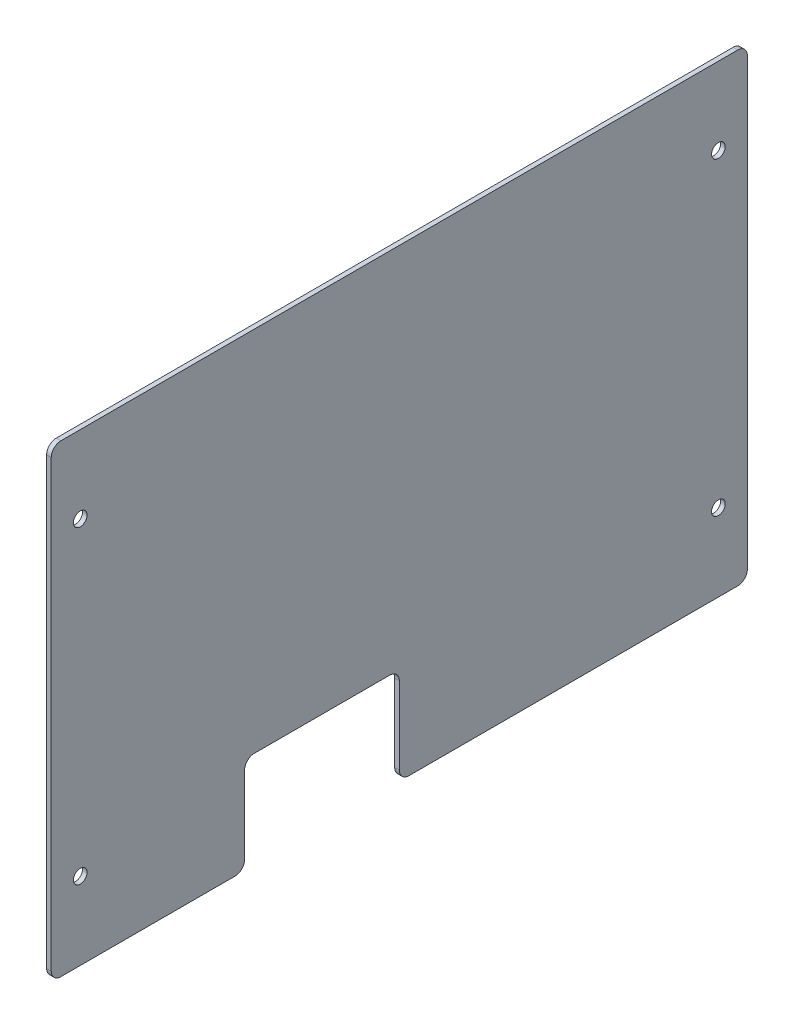
ISO-10303-21;
HEADER;
FILE_DESCRIPTION(('STEP AP214'),'2;1');
FILE_NAME('part.step','',(''),(''),'','','');
FILE_SCHEMA(('AUTOMOTIVE_DESIGN { 1 0 10303 214 1 1 1 1 }'));
ENDSEC;
DATA;
#1=APPLICATION_CONTEXT('core data for automotive mechanical design processes');
#2=APPLICATION_PROTOCOL_DEFINITION('international standard','automotive_design',2000,#1);
#3=PRODUCT_CONTEXT('',#1,'mechanical');
#4=PRODUCT('Part','Part','',(#3));
#5=PRODUCT_RELATED_PRODUCT_CATEGORY('part','',(#4));
#6=PRODUCT_DEFINITION_FORMATION('','',#4);
#7=PRODUCT_DEFINITION_CONTEXT('part definition',#1,'design');
#8=PRODUCT_DEFINITION('design','',#6,#7);
#9=PRODUCT_DEFINITION_SHAPE('','',#8);
#10=(LENGTH_UNIT() NAMED_UNIT(*) SI_UNIT(.MILLI.,.METRE.));
#11=(NAMED_UNIT(*) PLANE_ANGLE_UNIT() SI_UNIT($,.RADIAN.));
#12=(NAMED_UNIT(*) SI_UNIT($,.STERADIAN.) SOLID_ANGLE_UNIT());
#13=UNCERTAINTY_MEASURE_WITH_UNIT(LENGTH_MEASURE(1.E-05),#10,'distance_accuracy_value','');
#14=(GEOMETRIC_REPRESENTATION_CONTEXT(3) GLOBAL_UNCERTAINTY_ASSIGNED_CONTEXT((#13)) GLOBAL_UNIT_ASSIGNED_CONTEXT((#10,
#11,#12)) REPRESENTATION_CONTEXT('',''));
#15=CARTESIAN_POINT('',(0.,0.,0.));
#16=DIRECTION('',(0.,0.,1.));
#17=DIRECTION('',(1.,0.,0.));
#18=AXIS2_PLACEMENT_3D('',#15,#16,#17);
#19=CARTESIAN_POINT('',(-3.03783999999996,146.05,-222.25));
#20=DIRECTION('',(1.,0.,0.));
#21=DIRECTION('',(0.,0.,-1.));
#22=AXIS2_PLACEMENT_3D('',#19,#20,#21);
#23=CYLINDRICAL_SURFACE('',#22,6.34999999999999);
#24=CARTESIAN_POINT('',(1.11022302462516E-13,146.05,-222.25));
#25=DIRECTION('',(1.,0.,0.));
#26=DIRECTION('',(0.,0.,1.));
#27=AXIS2_PLACEMENT_3D('',#24,#25,#26);
#28=CIRCLE('',#27,6.34999999999999);
#29=CARTESIAN_POINT('',(0.,146.05,-228.6));
#30=VERTEX_POINT('',#29);
#31=CARTESIAN_POINT('',(0.,152.400000000001,-222.25));
#32=VERTEX_POINT('',#31);
#33=EDGE_CURVE('E183',#30,#32,#28,.T.);
#34=ORIENTED_EDGE('',*,*,#33,.F.);
#35=DIRECTION('',(1.,0.,0.));
#36=VECTOR('',#35,1.);
#37=CARTESIAN_POINT('',(-3.03784000000007,146.05,-228.6));
#38=LINE('',#37,#36);
#39=CARTESIAN_POINT('',(-3.03784000000007,146.05,-228.6));
#40=VERTEX_POINT('',#39);
#41=EDGE_CURVE('E11',#40,#30,#38,.T.);
#42=ORIENTED_EDGE('',*,*,#41,.F.);
#43=CARTESIAN_POINT('',(-3.03783999999996,146.05,-222.25));
#44=DIRECTION('',(1.,0.,0.));
#45=DIRECTION('',(0.,0.,1.));
#46=AXIS2_PLACEMENT_3D('',#43,#44,#45);
#47=CIRCLE('',#46,6.34999999999999);
#48=CARTESIAN_POINT('',(-3.03783999999985,152.400000000001,-222.25));
#49=VERTEX_POINT('',#48);
#50=EDGE_CURVE('E228',#40,#49,#47,.T.);
#51=ORIENTED_EDGE('',*,*,#50,.T.);
#52=DIRECTION('',(1.,0.,0.));
#53=VECTOR('',#52,1.);
#54=CARTESIAN_POINT('',(-3.03783999999985,152.400000000001,-222.25));
#55=LINE('',#54,#53);
#56=EDGE_CURVE('E41',#49,#32,#55,.T.);
#57=ORIENTED_EDGE('',*,*,#56,.T.);
#58=EDGE_LOOP('',(#34,#42,#51,#57));
#59=FACE_BOUND('',#58,.T.);
#60=ADVANCED_FACE('F38',(#59),#23,.T.);
#61=CARTESIAN_POINT('',(-3.03784000000007,-146.05,-228.6));
#62=DIRECTION('',(0.,0.,-1.));
#63=DIRECTION('',(-1.,0.,0.));
#64=AXIS2_PLACEMENT_3D('',#61,#62,#63);
#65=PLANE('',#64);
#66=DIRECTION('',(0.,1.,0.));
#67=VECTOR('',#66,1.);
#68=CARTESIAN_POINT('',(1.11022302462516E-13,-146.05,-228.6));
#69=LINE('',#68,#67);
#70=CARTESIAN_POINT('',(1.11022302462516E-13,-146.05,-228.6));
#71=VERTEX_POINT('',#70);
#72=EDGE_CURVE('E226',#71,#30,#69,.T.);
#73=ORIENTED_EDGE('',*,*,#72,.F.);
#74=DIRECTION('',(1.,0.,0.));
#75=VECTOR('',#74,1.);
#76=CARTESIAN_POINT('',(-3.03784000000007,-146.05,-228.6));
#77=LINE('',#76,#75);
#78=CARTESIAN_POINT('',(-3.03784000000007,-146.05,-228.6));
#79=VERTEX_POINT('',#78);
#80=EDGE_CURVE('E47',#79,#71,#77,.T.);
#81=ORIENTED_EDGE('',*,*,#80,.F.);
#82=DIRECTION('',(0.,1.,0.));
#83=VECTOR('',#82,1.);
#84=CARTESIAN_POINT('',(-3.03784000000007,-146.05,-228.6));
#85=LINE('',#84,#83);
#86=EDGE_CURVE('E173',#79,#40,#85,.T.);
#87=ORIENTED_EDGE('',*,*,#86,.T.);
#88=ORIENTED_EDGE('',*,*,#41,.T.);
#89=EDGE_LOOP('',(#73,#81,#87,#88));
#90=FACE_BOUND('',#89,.T.);
#91=ADVANCED_FACE('F256',(#90),#65,.T.);
#92=CARTESIAN_POINT('',(-3.03783999999996,-146.05,-222.25));
#93=DIRECTION('',(1.,0.,0.));
#94=DIRECTION('',(0.,0.,-1.));
#95=AXIS2_PLACEMENT_3D('',#92,#93,#94);
#96=CYLINDRICAL_SURFACE('',#95,6.35000000000001);
#97=CARTESIAN_POINT('',(0.,-146.05,-222.25));
#98=DIRECTION('',(1.,0.,0.));
#99=DIRECTION('',(0.,0.,1.));
#100=AXIS2_PLACEMENT_3D('',#97,#98,#99);
#101=CIRCLE('',#100,6.35000000000001);
#102=CARTESIAN_POINT('',(0.,-152.4,-222.25));
#103=VERTEX_POINT('',#102);
#104=EDGE_CURVE('E160',#103,#71,#101,.T.);
#105=ORIENTED_EDGE('',*,*,#104,.F.);
#106=DIRECTION('',(1.,0.,0.));
#107=VECTOR('',#106,1.);
#108=CARTESIAN_POINT('',(-3.03783999999996,-152.4,-222.25));
#109=LINE('',#108,#107);
#110=CARTESIAN_POINT('',(-3.03783999999996,-152.4,-222.25));
#111=VERTEX_POINT('',#110);
#112=EDGE_CURVE('E155',#111,#103,#109,.T.);
#113=ORIENTED_EDGE('',*,*,#112,.F.);
#114=CARTESIAN_POINT('',(-3.03783999999996,-146.05,-222.25));
#115=DIRECTION('',(1.,0.,0.));
#116=DIRECTION('',(0.,0.,1.));
#117=AXIS2_PLACEMENT_3D('',#114,#115,#116);
#118=CIRCLE('',#117,6.35000000000001);
#119=EDGE_CURVE('E158',#111,#79,#118,.T.);
#120=ORIENTED_EDGE('',*,*,#119,.T.);
#121=ORIENTED_EDGE('',*,*,#80,.T.);
#122=EDGE_LOOP('',(#105,#113,#120,#121));
#123=FACE_BOUND('',#122,.T.);
#124=ADVANCED_FACE('F157',(#123),#96,.T.);
#125=CARTESIAN_POINT('',(-3.03783999999996,-152.4,-222.25));
#126=DIRECTION('',(0.,-1.,0.));
#127=DIRECTION('',(0.,0.,-1.));
#128=AXIS2_PLACEMENT_3D('',#125,#126,#127);
#129=PLANE('',#128);
#130=DIRECTION('',(0.,0.,-1.));
#131=VECTOR('',#130,1.);
#132=CARTESIAN_POINT('',(0.,-152.4,-222.25));
#133=LINE('',#132,#131);
#134=CARTESIAN_POINT('',(-1.11022302462516E-13,-152.399999999999,-6.34999999999974));
#135=VERTEX_POINT('',#134);
#136=EDGE_CURVE('E223',#135,#103,#133,.T.);
#137=ORIENTED_EDGE('',*,*,#136,.F.);
#138=DIRECTION('',(1.,0.,0.));
#139=VECTOR('',#138,1.);
#140=CARTESIAN_POINT('',(-3.03784000000007,-152.399999999999,-6.34999999999997));
#141=LINE('',#140,#139);
#142=CARTESIAN_POINT('',(-3.03784000000007,-152.399999999999,-6.34999999999997));
#143=VERTEX_POINT('',#142);
#144=EDGE_CURVE('E165',#143,#135,#141,.T.);
#145=ORIENTED_EDGE('',*,*,#144,.F.);
#146=DIRECTION('',(0.,0.,-1.));
#147=VECTOR('',#146,1.);
#148=CARTESIAN_POINT('',(-3.03783999999996,-152.4,-222.25));
#149=LINE('',#148,#147);
#150=EDGE_CURVE('E171',#143,#111,#149,.T.);
#151=ORIENTED_EDGE('',*,*,#150,.T.);
#152=ORIENTED_EDGE('',*,*,#112,.T.);
#153=EDGE_LOOP('',(#137,#145,#151,#152));
#154=FACE_BOUND('',#153,.T.);
#155=ADVANCED_FACE('F175',(#154),#129,.T.);
#156=CARTESIAN_POINT('',(-3.03783999999996,-146.05,-6.35000000000008));
#157=DIRECTION('',(1.,0.,0.));
#158=DIRECTION('',(0.,0.,-1.));
#159=AXIS2_PLACEMENT_3D('',#156,#157,#158);
#160=CYLINDRICAL_SURFACE('',#159,6.34999999999998);
#161=CARTESIAN_POINT('',(1.11022302462516E-13,-146.05,-6.34999999999997));
#162=DIRECTION('',(1.,0.,0.));
#163=DIRECTION('',(0.,0.,-1.));
#164=AXIS2_PLACEMENT_3D('',#161,#162,#163);
#165=CIRCLE('',#164,6.34999999999998);
#166=CARTESIAN_POINT('',(0.,-146.05,0.));
#167=VERTEX_POINT('',#166);
#168=EDGE_CURVE('E220',#167,#135,#165,.T.);
#169=ORIENTED_EDGE('',*,*,#168,.F.);
#170=DIRECTION('',(1.,0.,0.));
#171=VECTOR('',#170,1.);
#172=CARTESIAN_POINT('',(-3.03784000000007,-146.05,0.));
#173=LINE('',#172,#171);
#174=CARTESIAN_POINT('',(-3.03784000000007,-146.05,0.));
#175=VERTEX_POINT('',#174);
#176=EDGE_CURVE('E232',#175,#167,#173,.T.);
#177=ORIENTED_EDGE('',*,*,#176,.F.);
#178=CARTESIAN_POINT('',(-3.03783999999996,-146.05,-6.35000000000008));
#179=DIRECTION('',(1.,0.,0.));
#180=DIRECTION('',(0.,0.,-1.));
#181=AXIS2_PLACEMENT_3D('',#178,#179,#180);
#182=CIRCLE('',#181,6.34999999999998);
#183=EDGE_CURVE('E176',#175,#143,#182,.T.);
#184=ORIENTED_EDGE('',*,*,#183,.T.);
#185=ORIENTED_EDGE('',*,*,#144,.T.);
#186=EDGE_LOOP('',(#169,#177,#184,#185));
#187=FACE_BOUND('',#186,.T.);
#188=ADVANCED_FACE('F269',(#187),#160,.T.);
#189=CARTESIAN_POINT('',(-3.03784000000007,-146.05,0.));
#190=DIRECTION('',(0.,0.,1.));
#191=DIRECTION('',(1.,0.,0.));
#192=AXIS2_PLACEMENT_3D('',#189,#190,#191);
#193=PLANE('',#192);
#194=DIRECTION('',(0.,-1.,0.));
#195=VECTOR('',#194,1.);
#196=CARTESIAN_POINT('',(0.,-146.05,0.));
#197=LINE('',#196,#195);
#198=CARTESIAN_POINT('',(-1.11022302462516E-13,-95.2500000000001,0.));
#199=VERTEX_POINT('',#198);
#200=EDGE_CURVE('E217',#199,#167,#197,.T.);
#201=ORIENTED_EDGE('',*,*,#200,.F.);
#202=DIRECTION('',(1.,0.,0.));
#203=VECTOR('',#202,1.);
#204=CARTESIAN_POINT('',(-3.03783999999985,-95.2499999999998,0.));
#205=LINE('',#204,#203);
#206=CARTESIAN_POINT('',(-3.03783999999985,-95.2499999999998,0.));
#207=VERTEX_POINT('',#206);
#208=EDGE_CURVE('E234',#207,#199,#205,.T.);
#209=ORIENTED_EDGE('',*,*,#208,.F.);
#210=DIRECTION('',(0.,-1.,0.));
#211=VECTOR('',#210,1.);
#212=CARTESIAN_POINT('',(-3.03784000000007,-146.05,0.));
#213=LINE('',#212,#211);
#214=EDGE_CURVE('E178',#207,#175,#213,.T.);
#215=ORIENTED_EDGE('',*,*,#214,.T.);
#216=ORIENTED_EDGE('',*,*,#176,.T.);
#217=EDGE_LOOP('',(#201,#209,#215,#216));
#218=FACE_BOUND('',#217,.T.);
#219=ADVANCED_FACE('F272',(#218),#193,.T.);
#220=CARTESIAN_POINT('',(-3.03783999999974,-95.2499999999998,6.35000000000008));
#221=DIRECTION('',(1.,0.,0.));
#222=DIRECTION('',(0.,0.,-1.));
#223=AXIS2_PLACEMENT_3D('',#220,#221,#222);
#224=CYLINDRICAL_SURFACE('',#223,6.34999999999999);
#225=CARTESIAN_POINT('',(0.,-95.2499999999998,6.34999999999997));
#226=DIRECTION('',(-1.,0.,0.));
#227=DIRECTION('',(0.,0.,1.));
#228=AXIS2_PLACEMENT_3D('',#225,#226,#227);
#229=CIRCLE('',#228,6.34999999999999);
#230=CARTESIAN_POINT('',(-1.11022302462516E-13,-88.8999999999995,6.34999999999997));
#231=VERTEX_POINT('',#230);
#232=EDGE_CURVE('E214',#231,#199,#229,.T.);
#233=ORIENTED_EDGE('',*,*,#232,.F.);
#234=DIRECTION('',(1.,0.,0.));
#235=VECTOR('',#234,1.);
#236=CARTESIAN_POINT('',(-3.03784000000007,-88.8999999999995,6.35000000000008));
#237=LINE('',#236,#235);
#238=CARTESIAN_POINT('',(-3.03784000000007,-88.8999999999995,6.35000000000008));
#239=VERTEX_POINT('',#238);
#240=EDGE_CURVE('E236',#239,#231,#237,.T.);
#241=ORIENTED_EDGE('',*,*,#240,.F.);
#242=CARTESIAN_POINT('',(-3.03783999999974,-95.2499999999998,6.35000000000008));
#243=DIRECTION('',(-1.,0.,0.));
#244=DIRECTION('',(0.,0.,1.));
#245=AXIS2_PLACEMENT_3D('',#242,#243,#244);
#246=CIRCLE('',#245,6.34999999999999);
#247=EDGE_CURVE('E394',#239,#207,#246,.T.);
#248=ORIENTED_EDGE('',*,*,#247,.T.);
#249=ORIENTED_EDGE('',*,*,#208,.T.);
#250=EDGE_LOOP('',(#233,#241,#248,#249));
#251=FACE_BOUND('',#250,.T.);
#252=ADVANCED_FACE('F276',(#251),#224,.F.);
#253=CARTESIAN_POINT('',(-3.03784000000007,-88.8999999999995,95.2500000000001));
#254=DIRECTION('',(0.,-1.,0.));
#255=DIRECTION('',(0.,0.,-1.));
#256=AXIS2_PLACEMENT_3D('',#253,#254,#255);
#257=PLANE('',#256);
#258=DIRECTION('',(0.,0.,-1.));
#259=VECTOR('',#258,1.);
#260=CARTESIAN_POINT('',(-1.11022302462516E-13,-88.8999999999995,95.2499999999999));
#261=LINE('',#260,#259);
#262=CARTESIAN_POINT('',(-1.11022302462516E-13,-88.8999999999995,95.2499999999999));
#263=VERTEX_POINT('',#262);
#264=EDGE_CURVE('E211',#263,#231,#261,.T.);
#265=ORIENTED_EDGE('',*,*,#264,.F.);
#266=DIRECTION('',(1.,0.,0.));
#267=VECTOR('',#266,1.);
#268=CARTESIAN_POINT('',(-3.03784000000007,-88.8999999999995,95.2500000000001));
#269=LINE('',#268,#267);
#270=CARTESIAN_POINT('',(-3.03784000000007,-88.8999999999995,95.2500000000001));
#271=VERTEX_POINT('',#270);
#272=EDGE_CURVE('E238',#271,#263,#269,.T.);
#273=ORIENTED_EDGE('',*,*,#272,.F.);
#274=DIRECTION('',(0.,0.,-1.));
#275=VECTOR('',#274,1.);
#276=CARTESIAN_POINT('',(-3.03784000000007,-88.8999999999995,95.2500000000001));
#277=LINE('',#276,#275);
#278=EDGE_CURVE('E391',#271,#239,#277,.T.);
#279=ORIENTED_EDGE('',*,*,#278,.T.);
#280=ORIENTED_EDGE('',*,*,#240,.T.);
#281=EDGE_LOOP('',(#265,#273,#279,#280));
#282=FACE_BOUND('',#281,.T.);
#283=ADVANCED_FACE('F280',(#282),#257,.T.);
#284=CARTESIAN_POINT('',(-3.03784000000007,-95.2499999999996,95.2500000000001));
#285=DIRECTION('',(1.,0.,0.));
#286=DIRECTION('',(0.,0.,-1.));
#287=AXIS2_PLACEMENT_3D('',#284,#285,#286);
#288=CYLINDRICAL_SURFACE('',#287,6.34999999999999);
#289=CARTESIAN_POINT('',(0.,-95.2499999999996,95.2500000000001));
#290=DIRECTION('',(-1.,0.,0.));
#291=DIRECTION('',(0.,0.,1.));
#292=AXIS2_PLACEMENT_3D('',#289,#290,#291);
#293=CIRCLE('',#292,6.34999999999999);
#294=CARTESIAN_POINT('',(1.11022302462516E-13,-95.2500000000001,101.6));
#295=VERTEX_POINT('',#294);
#296=EDGE_CURVE('E208',#295,#263,#293,.T.);
#297=ORIENTED_EDGE('',*,*,#296,.F.);
#298=DIRECTION('',(1.,0.,0.));
#299=VECTOR('',#298,1.);
#300=CARTESIAN_POINT('',(-3.03783999999996,-95.2499999999996,101.6));
#301=LINE('',#300,#299);
#302=CARTESIAN_POINT('',(-3.03783999999996,-95.2499999999996,101.6));
#303=VERTEX_POINT('',#302);
#304=EDGE_CURVE('E240',#303,#295,#301,.T.);
#305=ORIENTED_EDGE('',*,*,#304,.F.);
#306=CARTESIAN_POINT('',(-3.03784000000007,-95.2499999999996,95.2500000000001));
#307=DIRECTION('',(-1.,0.,0.));
#308=DIRECTION('',(0.,0.,1.));
#309=AXIS2_PLACEMENT_3D('',#306,#307,#308);
#310=CIRCLE('',#309,6.34999999999999);
#311=EDGE_CURVE('E388',#303,#271,#310,.T.);
#312=ORIENTED_EDGE('',*,*,#311,.T.);
#313=ORIENTED_EDGE('',*,*,#272,.T.);
#314=EDGE_LOOP('',(#297,#305,#312,#313));
#315=FACE_BOUND('',#314,.T.);
#316=ADVANCED_FACE('F284',(#315),#288,.F.);
#317=CARTESIAN_POINT('',(-3.03783999999985,-146.05,101.6));
#318=DIRECTION('',(0.,0.,-1.));
#319=DIRECTION('',(0.,1.,0.));
#320=AXIS2_PLACEMENT_3D('',#317,#318,#319);
#321=PLANE('',#320);
#322=DIRECTION('',(0.,1.,0.));
#323=VECTOR('',#322,1.);
#324=CARTESIAN_POINT('',(0.,-146.05,101.6));
#325=LINE('',#324,#323);
#326=CARTESIAN_POINT('',(0.,-146.05,101.6));
#327=VERTEX_POINT('',#326);
#328=EDGE_CURVE('E205',#327,#295,#325,.T.);
#329=ORIENTED_EDGE('',*,*,#328,.F.);
#330=DIRECTION('',(1.,0.,0.));
#331=VECTOR('',#330,1.);
#332=CARTESIAN_POINT('',(-3.03783999999985,-146.05,101.6));
#333=LINE('',#332,#331);
#334=CARTESIAN_POINT('',(-3.03783999999985,-146.05,101.6));
#335=VERTEX_POINT('',#334);
#336=EDGE_CURVE('E242',#335,#327,#333,.T.);
#337=ORIENTED_EDGE('',*,*,#336,.F.);
#338=DIRECTION('',(0.,1.,0.));
#339=VECTOR('',#338,1.);
#340=CARTESIAN_POINT('',(-3.03783999999985,-146.05,101.6));
#341=LINE('',#340,#339);
#342=EDGE_CURVE('E385',#335,#303,#341,.T.);
#343=ORIENTED_EDGE('',*,*,#342,.T.);
#344=ORIENTED_EDGE('',*,*,#304,.T.);
#345=EDGE_LOOP('',(#329,#337,#343,#344));
#346=FACE_BOUND('',#345,.T.);
#347=ADVANCED_FACE('F288',(#346),#321,.T.);
#348=CARTESIAN_POINT('',(-3.03784000000007,-146.05,107.95));
#349=DIRECTION('',(1.,0.,0.));
#350=DIRECTION('',(0.,0.,-1.));
#351=AXIS2_PLACEMENT_3D('',#348,#349,#350);
#352=CYLINDRICAL_SURFACE('',#351,6.34999999999997);
#353=CARTESIAN_POINT('',(-1.11022302462516E-13,-146.05,107.95));
#354=DIRECTION('',(1.,0.,0.));
#355=DIRECTION('',(0.,0.,-1.));
#356=AXIS2_PLACEMENT_3D('',#353,#354,#355);
#357=CIRCLE('',#356,6.34999999999997);
#358=CARTESIAN_POINT('',(-1.11022302462516E-13,-152.4,107.95));
#359=VERTEX_POINT('',#358);
#360=EDGE_CURVE('E202',#359,#327,#357,.T.);
#361=ORIENTED_EDGE('',*,*,#360,.F.);
#362=DIRECTION('',(1.,0.,0.));
#363=VECTOR('',#362,1.);
#364=CARTESIAN_POINT('',(-3.03783999999996,-152.4,107.95));
#365=LINE('',#364,#363);
#366=CARTESIAN_POINT('',(-3.03783999999996,-152.4,107.95));
#367=VERTEX_POINT('',#366);
#368=EDGE_CURVE('E244',#367,#359,#365,.T.);
#369=ORIENTED_EDGE('',*,*,#368,.F.);
#370=CARTESIAN_POINT('',(-3.03784000000007,-146.05,107.95));
#371=DIRECTION('',(1.,0.,0.));
#372=DIRECTION('',(0.,0.,-1.));
#373=AXIS2_PLACEMENT_3D('',#370,#371,#372);
#374=CIRCLE('',#373,6.34999999999997);
#375=EDGE_CURVE('E382',#367,#335,#374,.T.);
#376=ORIENTED_EDGE('',*,*,#375,.T.);
#377=ORIENTED_EDGE('',*,*,#336,.T.);
#378=EDGE_LOOP('',(#361,#369,#376,#377));
#379=FACE_BOUND('',#378,.T.);
#380=ADVANCED_FACE('F292',(#379),#352,.T.);
#381=CARTESIAN_POINT('',(-3.03783999999996,-152.4,107.95));
#382=DIRECTION('',(0.,-1.,0.));
#383=DIRECTION('',(0.,0.,-1.));
#384=AXIS2_PLACEMENT_3D('',#381,#382,#383);
#385=PLANE('',#384);
#386=DIRECTION('',(0.,0.,-1.));
#387=VECTOR('',#386,1.);
#388=CARTESIAN_POINT('',(-1.11022302462516E-13,-152.4,107.95));
#389=LINE('',#388,#387);
#390=CARTESIAN_POINT('',(1.11022302462516E-13,-152.4,222.25));
#391=VERTEX_POINT('',#390);
#392=EDGE_CURVE('E199',#391,#359,#389,.T.);
#393=ORIENTED_EDGE('',*,*,#392,.F.);
#394=DIRECTION('',(1.,0.,0.));
#395=VECTOR('',#394,1.);
#396=CARTESIAN_POINT('',(-3.03784000000007,-152.4,222.25));
#397=LINE('',#396,#395);
#398=CARTESIAN_POINT('',(-3.03784000000007,-152.4,222.25));
#399=VERTEX_POINT('',#398);
#400=EDGE_CURVE('E246',#399,#391,#397,.T.);
#401=ORIENTED_EDGE('',*,*,#400,.F.);
#402=DIRECTION('',(0.,0.,-1.));
#403=VECTOR('',#402,1.);
#404=CARTESIAN_POINT('',(-3.03783999999996,-152.4,107.95));
#405=LINE('',#404,#403);
#406=EDGE_CURVE('E379',#399,#367,#405,.T.);
#407=ORIENTED_EDGE('',*,*,#406,.T.);
#408=ORIENTED_EDGE('',*,*,#368,.T.);
#409=EDGE_LOOP('',(#393,#401,#407,#408));
#410=FACE_BOUND('',#409,.T.);
#411=ADVANCED_FACE('F296',(#410),#385,.T.);
#412=CARTESIAN_POINT('',(-3.03783999999985,-146.05,222.25));
#413=DIRECTION('',(1.,0.,0.));
#414=DIRECTION('',(0.,0.,-1.));
#415=AXIS2_PLACEMENT_3D('',#412,#413,#414);
#416=CYLINDRICAL_SURFACE('',#415,6.34999999999998);
#417=CARTESIAN_POINT('',(0.,-146.05,222.25));
#418=DIRECTION('',(1.,0.,0.));
#419=DIRECTION('',(0.,0.,1.));
#420=AXIS2_PLACEMENT_3D('',#417,#418,#419);
#421=CIRCLE('',#420,6.34999999999998);
#422=CARTESIAN_POINT('',(-1.11022302462516E-13,-146.05,228.6));
#423=VERTEX_POINT('',#422);
#424=EDGE_CURVE('E196',#423,#391,#421,.T.);
#425=ORIENTED_EDGE('',*,*,#424,.F.);
#426=DIRECTION('',(1.,0.,0.));
#427=VECTOR('',#426,1.);
#428=CARTESIAN_POINT('',(-3.03783999999985,-146.05,228.6));
#429=LINE('',#428,#427);
#430=CARTESIAN_POINT('',(-3.03783999999985,-146.05,228.6));
#431=VERTEX_POINT('',#430);
#432=EDGE_CURVE('E248',#431,#423,#429,.T.);
#433=ORIENTED_EDGE('',*,*,#432,.F.);
#434=CARTESIAN_POINT('',(-3.03783999999985,-146.05,222.25));
#435=DIRECTION('',(1.,0.,0.));
#436=DIRECTION('',(0.,0.,1.));
#437=AXIS2_PLACEMENT_3D('',#434,#435,#436);
#438=CIRCLE('',#437,6.34999999999998);
#439=EDGE_CURVE('E376',#431,#399,#438,.T.);
#440=ORIENTED_EDGE('',*,*,#439,.T.);
#441=ORIENTED_EDGE('',*,*,#400,.T.);
#442=EDGE_LOOP('',(#425,#433,#440,#441));
#443=FACE_BOUND('',#442,.T.);
#444=ADVANCED_FACE('F300',(#443),#416,.T.);
#445=CARTESIAN_POINT('',(-3.03783999999985,-146.05,228.6));
#446=DIRECTION('',(0.,0.,1.));
#447=DIRECTION('',(1.,0.,0.));
#448=AXIS2_PLACEMENT_3D('',#445,#446,#447);
#449=PLANE('',#448);
#450=DIRECTION('',(0.,-1.,0.));
#451=VECTOR('',#450,1.);
#452=CARTESIAN_POINT('',(-1.11022302462516E-13,-146.05,228.6));
#453=LINE('',#452,#451);
#454=CARTESIAN_POINT('',(-1.11022302462516E-13,146.05,228.6));
#455=VERTEX_POINT('',#454);
#456=EDGE_CURVE('E193',#455,#423,#453,.T.);
#457=ORIENTED_EDGE('',*,*,#456,.F.);
#458=DIRECTION('',(1.,0.,0.));
#459=VECTOR('',#458,1.);
#460=CARTESIAN_POINT('',(-3.03783999999985,146.05,228.6));
#461=LINE('',#460,#459);
#462=CARTESIAN_POINT('',(-3.03783999999985,146.05,228.6));
#463=VERTEX_POINT('',#462);
#464=EDGE_CURVE('E250',#463,#455,#461,.T.);
#465=ORIENTED_EDGE('',*,*,#464,.F.);
#466=DIRECTION('',(0.,-1.,0.));
#467=VECTOR('',#466,1.);
#468=CARTESIAN_POINT('',(-3.03783999999985,-146.05,228.6));
#469=LINE('',#468,#467);
#470=EDGE_CURVE('E373',#463,#431,#469,.T.);
#471=ORIENTED_EDGE('',*,*,#470,.T.);
#472=ORIENTED_EDGE('',*,*,#432,.T.);
#473=EDGE_LOOP('',(#457,#465,#471,#472));
#474=FACE_BOUND('',#473,.T.);
#475=ADVANCED_FACE('F304',(#474),#449,.T.);
#476=CARTESIAN_POINT('',(-3.03783999999985,146.050000000001,222.25));
#477=DIRECTION('',(1.,0.,0.));
#478=DIRECTION('',(0.,0.,-1.));
#479=AXIS2_PLACEMENT_3D('',#476,#477,#478);
#480=CYLINDRICAL_SURFACE('',#479,6.35000000000001);
#481=CARTESIAN_POINT('',(-1.11022302462516E-13,146.05,222.25));
#482=DIRECTION('',(1.,0.,0.));
#483=DIRECTION('',(0.,0.,1.));
#484=AXIS2_PLACEMENT_3D('',#481,#482,#483);
#485=CIRCLE('',#484,6.35000000000001);
#486=CARTESIAN_POINT('',(-1.11022302462516E-13,152.400000000001,222.25));
#487=VERTEX_POINT('',#486);
#488=EDGE_CURVE('E190',#487,#455,#485,.T.);
#489=ORIENTED_EDGE('',*,*,#488,.F.);
#490=DIRECTION('',(1.,0.,0.));
#491=VECTOR('',#490,1.);
#492=CARTESIAN_POINT('',(-3.03783999999985,152.400000000001,222.25));
#493=LINE('',#492,#491);
#494=CARTESIAN_POINT('',(-3.03783999999985,152.400000000001,222.25));
#495=VERTEX_POINT('',#494);
#496=EDGE_CURVE('E251',#495,#487,#493,.T.);
#497=ORIENTED_EDGE('',*,*,#496,.F.);
#498=CARTESIAN_POINT('',(-3.03783999999985,146.050000000001,222.25));
#499=DIRECTION('',(1.,0.,0.));
#500=DIRECTION('',(0.,0.,1.));
#501=AXIS2_PLACEMENT_3D('',#498,#499,#500);
#502=CIRCLE('',#501,6.35000000000001);
#503=EDGE_CURVE('E370',#495,#463,#502,.T.);
#504=ORIENTED_EDGE('',*,*,#503,.T.);
#505=ORIENTED_EDGE('',*,*,#464,.T.);
#506=EDGE_LOOP('',(#489,#497,#504,#505));
#507=FACE_BOUND('',#506,.T.);
#508=ADVANCED_FACE('F308',(#507),#480,.T.);
#509=CARTESIAN_POINT('',(-3.03783999999985,152.400000000001,-222.25));
#510=DIRECTION('',(0.,1.,0.));
#511=DIRECTION('',(0.,0.,1.));
#512=AXIS2_PLACEMENT_3D('',#509,#510,#511);
#513=PLANE('',#512);
#514=DIRECTION('',(0.,0.,1.));
#515=VECTOR('',#514,1.);
#516=CARTESIAN_POINT('',(0.,152.400000000001,-222.25));
#517=LINE('',#516,#515);
#518=EDGE_CURVE('E186',#32,#487,#517,.T.);
#519=ORIENTED_EDGE('',*,*,#518,.F.);
#520=ORIENTED_EDGE('',*,*,#56,.F.);
#521=DIRECTION('',(0.,0.,1.));
#522=VECTOR('',#521,1.);
#523=CARTESIAN_POINT('',(-3.03783999999985,152.400000000001,-222.25));
#524=LINE('',#523,#522);
#525=EDGE_CURVE('E368',#49,#495,#524,.T.);
#526=ORIENTED_EDGE('',*,*,#525,.T.);
#527=ORIENTED_EDGE('',*,*,#496,.T.);
#528=EDGE_LOOP('',(#519,#520,#526,#527));
#529=FACE_BOUND('',#528,.T.);
#530=ADVANCED_FACE('F253',(#529),#513,.T.);
#531=CARTESIAN_POINT('',(-3.03783999999996,146.05,-222.25));
#532=DIRECTION('',(-1.,0.,0.));
#533=DIRECTION('',(0.,0.,1.));
#534=AXIS2_PLACEMENT_3D('',#531,#532,#533);
#535=PLANE('',#534);
#536=CARTESIAN_POINT('',(-3.03784000000007,101.600000000001,209.55));
#537=DIRECTION('',(1.,0.,0.));
#538=DIRECTION('',(0.,0.,-1.));
#539=AXIS2_PLACEMENT_3D('',#536,#537,#538);
#540=CIRCLE('',#539,4.5);
#541=CARTESIAN_POINT('',(-3.03784000000007,101.600000000001,205.05));
#542=VERTEX_POINT('',#541);
#543=EDGE_CURVE('E343',#542,#542,#540,.T.);
#544=ORIENTED_EDGE('',*,*,#543,.T.);
#545=EDGE_LOOP('',(#544));
#546=FACE_BOUND('',#545,.T.);
#547=CARTESIAN_POINT('',(-3.03784000000007,-101.599999999999,209.55));
#548=DIRECTION('',(1.,0.,0.));
#549=DIRECTION('',(0.,0.,-1.));
#550=AXIS2_PLACEMENT_3D('',#547,#548,#549);
#551=CIRCLE('',#550,4.5);
#552=CARTESIAN_POINT('',(-3.03784000000007,-101.599999999999,205.05));
#553=VERTEX_POINT('',#552);
#554=EDGE_CURVE('E353',#553,#553,#551,.T.);
#555=ORIENTED_EDGE('',*,*,#554,.T.);
#556=EDGE_LOOP('',(#555));
#557=FACE_BOUND('',#556,.T.);
#558=CARTESIAN_POINT('',(-3.03784000000007,-101.599999999999,-209.55));
#559=DIRECTION('',(1.,0.,0.));
#560=DIRECTION('',(0.,0.,-1.));
#561=AXIS2_PLACEMENT_3D('',#558,#559,#560);
#562=CIRCLE('',#561,4.5);
#563=CARTESIAN_POINT('',(-3.03784000000007,-101.599999999999,-214.05));
#564=VERTEX_POINT('',#563);
#565=EDGE_CURVE('E359',#564,#564,#562,.T.);
#566=ORIENTED_EDGE('',*,*,#565,.T.);
#567=EDGE_LOOP('',(#566));
#568=FACE_BOUND('',#567,.T.);
#569=CARTESIAN_POINT('',(-3.03784000000007,101.600000000001,-209.55));
#570=DIRECTION('',(1.,0.,0.));
#571=DIRECTION('',(0.,0.,-1.));
#572=AXIS2_PLACEMENT_3D('',#569,#570,#571);
#573=CIRCLE('',#572,4.5);
#574=CARTESIAN_POINT('',(-3.03784000000007,101.600000000001,-214.05));
#575=VERTEX_POINT('',#574);
#576=EDGE_CURVE('E187',#575,#575,#573,.T.);
#577=ORIENTED_EDGE('',*,*,#576,.T.);
#578=EDGE_LOOP('',(#577));
#579=FACE_BOUND('',#578,.T.);
#580=ORIENTED_EDGE('',*,*,#50,.F.);
#581=ORIENTED_EDGE('',*,*,#86,.F.);
#582=ORIENTED_EDGE('',*,*,#119,.F.);
#583=ORIENTED_EDGE('',*,*,#150,.F.);
#584=ORIENTED_EDGE('',*,*,#183,.F.);
#585=ORIENTED_EDGE('',*,*,#214,.F.);
#586=ORIENTED_EDGE('',*,*,#247,.F.);
#587=ORIENTED_EDGE('',*,*,#278,.F.);
#588=ORIENTED_EDGE('',*,*,#311,.F.);
#589=ORIENTED_EDGE('',*,*,#342,.F.);
#590=ORIENTED_EDGE('',*,*,#375,.F.);
#591=ORIENTED_EDGE('',*,*,#406,.F.);
#592=ORIENTED_EDGE('',*,*,#439,.F.);
#593=ORIENTED_EDGE('',*,*,#470,.F.);
#594=ORIENTED_EDGE('',*,*,#503,.F.);
#595=ORIENTED_EDGE('',*,*,#525,.F.);
#596=EDGE_LOOP('',(#580,#581,#582,#583,#584,#585,#586,#587,#588,#589,#590,#591,#592,#593,#594,#595));
#597=FACE_BOUND('',#596,.T.);
#598=ADVANCED_FACE('F169',(#546,#557,#568,#579,#597),#535,.T.);
#599=CARTESIAN_POINT('',(1.11022302462516E-13,146.05,-222.25));
#600=DIRECTION('',(-1.,0.,0.));
#601=DIRECTION('',(0.,0.,1.));
#602=AXIS2_PLACEMENT_3D('',#599,#600,#601);
#603=PLANE('',#602);
#604=CARTESIAN_POINT('',(-1.11022302462516E-13,101.600000000001,209.55));
#605=DIRECTION('',(1.,0.,0.));
#606=DIRECTION('',(0.,0.,-1.));
#607=AXIS2_PLACEMENT_3D('',#604,#605,#606);
#608=CIRCLE('',#607,4.49999999999999);
#609=CARTESIAN_POINT('',(-1.11022302462516E-13,101.600000000001,205.05));
#610=VERTEX_POINT('',#609);
#611=EDGE_CURVE('E346',#610,#610,#608,.T.);
#612=ORIENTED_EDGE('',*,*,#611,.F.);
#613=EDGE_LOOP('',(#612));
#614=FACE_BOUND('',#613,.T.);
#615=CARTESIAN_POINT('',(1.11022302462516E-13,-101.599999999999,209.55));
#616=DIRECTION('',(1.,0.,0.));
#617=DIRECTION('',(0.,0.,-1.));
#618=AXIS2_PLACEMENT_3D('',#615,#616,#617);
#619=CIRCLE('',#618,4.49999999999999);
#620=CARTESIAN_POINT('',(1.11022302462516E-13,-101.599999999999,205.05));
#621=VERTEX_POINT('',#620);
#622=EDGE_CURVE('E348',#621,#621,#619,.T.);
#623=ORIENTED_EDGE('',*,*,#622,.F.);
#624=EDGE_LOOP('',(#623));
#625=FACE_BOUND('',#624,.T.);
#626=CARTESIAN_POINT('',(0.,-101.599999999999,-209.55));
#627=DIRECTION('',(1.,0.,0.));
#628=DIRECTION('',(0.,0.,-1.));
#629=AXIS2_PLACEMENT_3D('',#626,#627,#628);
#630=CIRCLE('',#629,4.49999999999999);
#631=CARTESIAN_POINT('',(0.,-101.599999999999,-214.05));
#632=VERTEX_POINT('',#631);
#633=EDGE_CURVE('E356',#632,#632,#630,.T.);
#634=ORIENTED_EDGE('',*,*,#633,.F.);
#635=EDGE_LOOP('',(#634));
#636=FACE_BOUND('',#635,.T.);
#637=CARTESIAN_POINT('',(-1.11022302462516E-13,101.600000000001,-209.55));
#638=DIRECTION('',(1.,0.,0.));
#639=DIRECTION('',(0.,0.,-1.));
#640=AXIS2_PLACEMENT_3D('',#637,#638,#639);
#641=CIRCLE('',#640,4.49999999999999);
#642=CARTESIAN_POINT('',(-1.11022302462516E-13,101.600000000001,-214.05));
#643=VERTEX_POINT('',#642);
#644=EDGE_CURVE('E362',#643,#643,#641,.T.);
#645=ORIENTED_EDGE('',*,*,#644,.F.);
#646=EDGE_LOOP('',(#645));
#647=FACE_BOUND('',#646,.T.);
#648=ORIENTED_EDGE('',*,*,#33,.T.);
#649=ORIENTED_EDGE('',*,*,#518,.T.);
#650=ORIENTED_EDGE('',*,*,#488,.T.);
#651=ORIENTED_EDGE('',*,*,#456,.T.);
#652=ORIENTED_EDGE('',*,*,#424,.T.);
#653=ORIENTED_EDGE('',*,*,#392,.T.);
#654=ORIENTED_EDGE('',*,*,#360,.T.);
#655=ORIENTED_EDGE('',*,*,#328,.T.);
#656=ORIENTED_EDGE('',*,*,#296,.T.);
#657=ORIENTED_EDGE('',*,*,#264,.T.);
#658=ORIENTED_EDGE('',*,*,#232,.T.);
#659=ORIENTED_EDGE('',*,*,#200,.T.);
#660=ORIENTED_EDGE('',*,*,#168,.T.);
#661=ORIENTED_EDGE('',*,*,#136,.T.);
#662=ORIENTED_EDGE('',*,*,#104,.T.);
#663=ORIENTED_EDGE('',*,*,#72,.T.);
#664=EDGE_LOOP('',(#648,#649,#650,#651,#652,#653,#654,#655,#656,#657,#658,#659,#660,#661,#662,#663));
#665=FACE_BOUND('',#664,.T.);
#666=ADVANCED_FACE('F255',(#614,#625,#636,#647,#665),#603,.F.);
#667=CARTESIAN_POINT('',(-1.11022302462516E-13,101.600000000001,-209.55));
#668=DIRECTION('',(1.,0.,0.));
#669=DIRECTION('',(0.,0.,-1.));
#670=AXIS2_PLACEMENT_3D('',#667,#668,#669);
#671=CYLINDRICAL_SURFACE('',#670,4.5);
#672=ORIENTED_EDGE('',*,*,#576,.F.);
#673=EDGE_LOOP('',(#672));
#674=FACE_BOUND('',#673,.T.);
#675=ORIENTED_EDGE('',*,*,#644,.T.);
#676=EDGE_LOOP('',(#675));
#677=FACE_BOUND('',#676,.T.);
#678=ADVANCED_FACE('F320',(#674,#677),#671,.F.);
#679=CARTESIAN_POINT('',(0.,-101.599999999999,-209.55));
#680=DIRECTION('',(1.,0.,0.));
#681=DIRECTION('',(0.,0.,-1.));
#682=AXIS2_PLACEMENT_3D('',#679,#680,#681);
#683=CYLINDRICAL_SURFACE('',#682,4.5);
#684=ORIENTED_EDGE('',*,*,#565,.F.);
#685=EDGE_LOOP('',(#684));
#686=FACE_BOUND('',#685,.T.);
#687=ORIENTED_EDGE('',*,*,#633,.T.);
#688=EDGE_LOOP('',(#687));
#689=FACE_BOUND('',#688,.T.);
#690=ADVANCED_FACE('F327',(#686,#689),#683,.F.);
#691=CARTESIAN_POINT('',(1.11022302462516E-13,-101.599999999999,209.55));
#692=DIRECTION('',(1.,0.,0.));
#693=DIRECTION('',(0.,0.,-1.));
#694=AXIS2_PLACEMENT_3D('',#691,#692,#693);
#695=CYLINDRICAL_SURFACE('',#694,4.5);
#696=ORIENTED_EDGE('',*,*,#554,.F.);
#697=EDGE_LOOP('',(#696));
#698=FACE_BOUND('',#697,.T.);
#699=ORIENTED_EDGE('',*,*,#622,.T.);
#700=EDGE_LOOP('',(#699));
#701=FACE_BOUND('',#700,.T.);
#702=ADVANCED_FACE('F331',(#698,#701),#695,.F.);
#703=CARTESIAN_POINT('',(-1.11022302462516E-13,101.600000000001,209.55));
#704=DIRECTION('',(1.,0.,0.));
#705=DIRECTION('',(0.,0.,-1.));
#706=AXIS2_PLACEMENT_3D('',#703,#704,#705);
#707=CYLINDRICAL_SURFACE('',#706,4.5);
#708=ORIENTED_EDGE('',*,*,#543,.F.);
#709=EDGE_LOOP('',(#708));
#710=FACE_BOUND('',#709,.T.);
#711=ORIENTED_EDGE('',*,*,#611,.T.);
#712=EDGE_LOOP('',(#711));
#713=FACE_BOUND('',#712,.T.);
#714=ADVANCED_FACE('F335',(#710,#713),#707,.F.);
#715=CLOSED_SHELL('',(#60,#91,#124,#155,#188,#219,#252,#283,#316,#347,#380,#411,#444,#475,#508,
#530,#598,#666,#678,#690,#702,#714));
#716=MANIFOLD_SOLID_BREP('B2',#715);
#717=ADVANCED_BREP_SHAPE_REPRESENTATION('',(#18,#716),#14);
#718=SHAPE_DEFINITION_REPRESENTATION(#9,#717);
ENDSEC;
END-ISO-10303-21;
